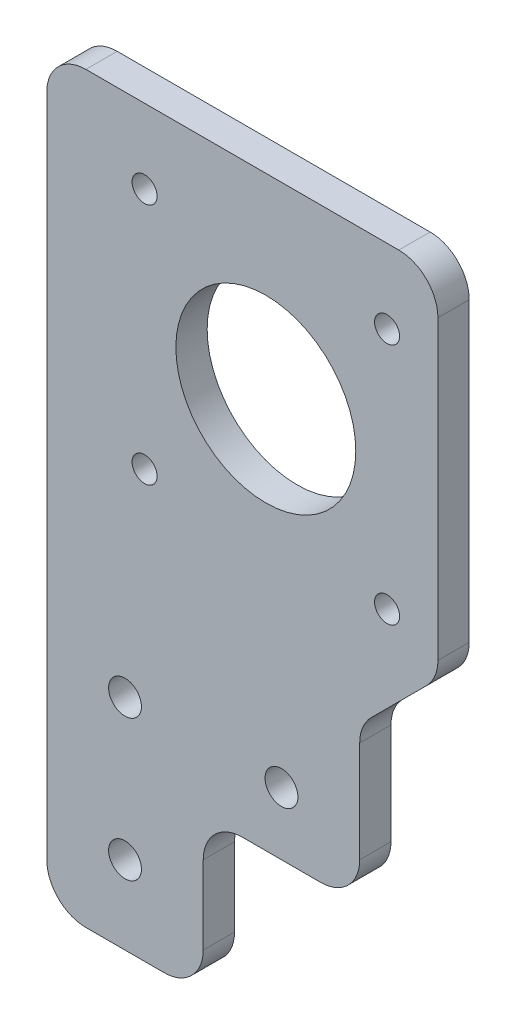
ISO-10303-21;
HEADER;
FILE_DESCRIPTION(('STEP AP214'),'2;1');
FILE_NAME('part.step','',(''),(''),'','','');
FILE_SCHEMA(('AUTOMOTIVE_DESIGN { 1 0 10303 214 1 1 1 1 }'));
ENDSEC;
DATA;
#1=APPLICATION_CONTEXT('core data for automotive mechanical design processes');
#2=APPLICATION_PROTOCOL_DEFINITION('international standard','automotive_design',2000,#1);
#3=PRODUCT_CONTEXT('',#1,'mechanical');
#4=PRODUCT('Part','Part','',(#3));
#5=PRODUCT_RELATED_PRODUCT_CATEGORY('part','',(#4));
#6=PRODUCT_DEFINITION_FORMATION('','',#4);
#7=PRODUCT_DEFINITION_CONTEXT('part definition',#1,'design');
#8=PRODUCT_DEFINITION('design','',#6,#7);
#9=PRODUCT_DEFINITION_SHAPE('','',#8);
#10=(LENGTH_UNIT() NAMED_UNIT(*) SI_UNIT(.MILLI.,.METRE.));
#11=(NAMED_UNIT(*) PLANE_ANGLE_UNIT() SI_UNIT($,.RADIAN.));
#12=(NAMED_UNIT(*) SI_UNIT($,.STERADIAN.) SOLID_ANGLE_UNIT());
#13=UNCERTAINTY_MEASURE_WITH_UNIT(LENGTH_MEASURE(1.E-05),#10,'distance_accuracy_value','');
#14=(GEOMETRIC_REPRESENTATION_CONTEXT(3) GLOBAL_UNCERTAINTY_ASSIGNED_CONTEXT((#13)) GLOBAL_UNIT_ASSIGNED_CONTEXT((#10,
#11,#12)) REPRESENTATION_CONTEXT('',''));
#15=CARTESIAN_POINT('',(0.,0.,0.));
#16=DIRECTION('',(0.,0.,1.));
#17=DIRECTION('',(1.,0.,0.));
#18=AXIS2_PLACEMENT_3D('',#15,#16,#17);
#19=CARTESIAN_POINT('',(269.028205207631,151.235355522005,4.));
#20=DIRECTION('',(0.,0.,1.));
#21=DIRECTION('',(1.,0.,0.));
#22=AXIS2_PLACEMENT_3D('',#19,#20,#21);
#23=PLANE('',#22);
#24=CARTESIAN_POINT('',(234.028275207634,109.16437185227,4.));
#25=DIRECTION('',(0.,0.,1.));
#26=DIRECTION('',(1.,0.,0.));
#27=AXIS2_PLACEMENT_3D('',#24,#25,#26);
#28=CIRCLE('',#27,2.09999579999995);
#29=CARTESIAN_POINT('',(236.128271007633,109.16437185227,4.));
#30=VERTEX_POINT('',#29);
#31=EDGE_CURVE('E358',#30,#30,#28,.T.);
#32=ORIENTED_EDGE('',*,*,#31,.F.);
#33=EDGE_LOOP('',(#32));
#34=FACE_BOUND('',#33,.T.);
#35=CARTESIAN_POINT('',(254.028235207634,127.164335852281,4.));
#36=DIRECTION('',(0.,0.,1.));
#37=DIRECTION('',(1.,0.,0.));
#38=AXIS2_PLACEMENT_3D('',#35,#36,#37);
#39=CIRCLE('',#38,2.09999579999998);
#40=CARTESIAN_POINT('',(256.128231007633,127.164335852281,4.));
#41=VERTEX_POINT('',#40);
#42=EDGE_CURVE('E370',#41,#41,#39,.T.);
#43=ORIENTED_EDGE('',*,*,#42,.F.);
#44=EDGE_LOOP('',(#43));
#45=FACE_BOUND('',#44,.T.);
#46=CARTESIAN_POINT('',(236.528270207633,153.664282852282,4.));
#47=DIRECTION('',(0.,0.,1.));
#48=DIRECTION('',(1.,0.,0.));
#49=AXIS2_PLACEMENT_3D('',#46,#47,#48);
#50=CIRCLE('',#49,1.59999679999998);
#51=CARTESIAN_POINT('',(238.128267007633,153.664282852282,4.));
#52=VERTEX_POINT('',#51);
#53=EDGE_CURVE('E382',#52,#52,#50,.T.);
#54=ORIENTED_EDGE('',*,*,#53,.F.);
#55=EDGE_LOOP('',(#54));
#56=FACE_BOUND('',#55,.T.);
#57=CARTESIAN_POINT('',(267.528208207634,184.664220852282,4.));
#58=DIRECTION('',(0.,0.,1.));
#59=DIRECTION('',(1.,0.,0.));
#60=AXIS2_PLACEMENT_3D('',#57,#58,#59);
#61=CIRCLE('',#60,1.59999679999995);
#62=CARTESIAN_POINT('',(269.128205007634,184.664220852282,4.));
#63=VERTEX_POINT('',#62);
#64=EDGE_CURVE('E181',#63,#63,#61,.T.);
#65=ORIENTED_EDGE('',*,*,#64,.F.);
#66=EDGE_LOOP('',(#65));
#67=FACE_BOUND('',#66,.T.);
#68=CARTESIAN_POINT('',(269.028205207631,151.235355522005,4.));
#69=DIRECTION('',(0.,0.,1.));
#70=DIRECTION('',(1.,0.,0.));
#71=AXIS2_PLACEMENT_3D('',#68,#69,#70);
#72=CIRCLE('',#71,4.99998999999902);
#73=CARTESIAN_POINT('',(272.563732042496,147.699828687141,4.));
#74=VERTEX_POINT('',#73);
#75=CARTESIAN_POINT('',(274.02819520763,151.235355522005,4.));
#76=VERTEX_POINT('',#75);
#77=EDGE_CURVE('E208',#74,#76,#72,.T.);
#78=ORIENTED_EDGE('',*,*,#77,.T.);
#79=DIRECTION('',(0.,1.,0.));
#80=VECTOR('',#79,1.);
#81=CARTESIAN_POINT('',(274.02819520763,189.16421185227,4.));
#82=LINE('',#81,#80);
#83=CARTESIAN_POINT('',(274.02819520763,189.16421185227,4.));
#84=VERTEX_POINT('',#83);
#85=EDGE_CURVE('E116',#76,#84,#82,.T.);
#86=ORIENTED_EDGE('',*,*,#85,.T.);
#87=CARTESIAN_POINT('',(269.02820520763,189.164211852282,4.));
#88=DIRECTION('',(0.,0.,1.));
#89=DIRECTION('',(1.,0.,0.));
#90=AXIS2_PLACEMENT_3D('',#87,#88,#89);
#91=CIRCLE('',#90,4.9999899999999);
#92=CARTESIAN_POINT('',(269.028205207634,194.164201852282,4.));
#93=VERTEX_POINT('',#92);
#94=EDGE_CURVE('E247',#84,#93,#91,.T.);
#95=ORIENTED_EDGE('',*,*,#94,.T.);
#96=DIRECTION('',(-1.,0.,0.));
#97=VECTOR('',#96,1.);
#98=CARTESIAN_POINT('',(229.028285207634,194.164201852282,4.));
#99=LINE('',#98,#97);
#100=CARTESIAN_POINT('',(229.028285207634,194.164201852282,4.));
#101=VERTEX_POINT('',#100);
#102=EDGE_CURVE('E266',#93,#101,#99,.T.);
#103=ORIENTED_EDGE('',*,*,#102,.T.);
#104=CARTESIAN_POINT('',(229.028285207633,189.164211852282,4.));
#105=DIRECTION('',(0.,0.,1.));
#106=DIRECTION('',(1.,0.,0.));
#107=AXIS2_PLACEMENT_3D('',#104,#105,#106);
#108=CIRCLE('',#107,4.99999000000008);
#109=CARTESIAN_POINT('',(224.028295207633,189.164211852282,4.));
#110=VERTEX_POINT('',#109);
#111=EDGE_CURVE('E263',#101,#110,#108,.T.);
#112=ORIENTED_EDGE('',*,*,#111,.T.);
#113=DIRECTION('',(0.,-1.,0.));
#114=VECTOR('',#113,1.);
#115=CARTESIAN_POINT('',(224.028295207634,104.164381852281,4.));
#116=LINE('',#115,#114);
#117=CARTESIAN_POINT('',(224.028295207634,104.164381852281,4.));
#118=VERTEX_POINT('',#117);
#119=EDGE_CURVE('E265',#110,#118,#116,.T.);
#120=ORIENTED_EDGE('',*,*,#119,.T.);
#121=CARTESIAN_POINT('',(229.028285207633,104.164381852281,4.));
#122=DIRECTION('',(0.,0.,1.));
#123=DIRECTION('',(1.,0.,0.));
#124=AXIS2_PLACEMENT_3D('',#121,#122,#123);
#125=CIRCLE('',#124,4.99998999999979);
#126=CARTESIAN_POINT('',(229.028285207633,99.1643918522813,4.));
#127=VERTEX_POINT('',#126);
#128=EDGE_CURVE('E268',#118,#127,#125,.T.);
#129=ORIENTED_EDGE('',*,*,#128,.T.);
#130=DIRECTION('',(1.,0.,0.));
#131=VECTOR('',#130,1.);
#132=CARTESIAN_POINT('',(239.028265207634,99.1643918522822,4.));
#133=LINE('',#132,#131);
#134=CARTESIAN_POINT('',(239.028265207634,99.1643918522822,4.));
#135=VERTEX_POINT('',#134);
#136=EDGE_CURVE('E274',#127,#135,#133,.T.);
#137=ORIENTED_EDGE('',*,*,#136,.T.);
#138=CARTESIAN_POINT('',(239.028265207634,104.164381852281,4.));
#139=DIRECTION('',(0.,0.,1.));
#140=DIRECTION('',(1.,0.,0.));
#141=AXIS2_PLACEMENT_3D('',#138,#139,#140);
#142=CIRCLE('',#141,4.99998999999905);
#143=CARTESIAN_POINT('',(244.028255207633,104.164381852278,4.));
#144=VERTEX_POINT('',#143);
#145=EDGE_CURVE('E276',#135,#144,#142,.T.);
#146=ORIENTED_EDGE('',*,*,#145,.T.);
#147=DIRECTION('',(0.,1.,0.));
#148=VECTOR('',#147,1.);
#149=CARTESIAN_POINT('',(244.028255207633,114.164361852279,4.));
#150=LINE('',#149,#148);
#151=CARTESIAN_POINT('',(244.028255207633,114.164361852279,4.));
#152=VERTEX_POINT('',#151);
#153=EDGE_CURVE('E278',#144,#152,#150,.T.);
#154=ORIENTED_EDGE('',*,*,#153,.T.);
#155=CARTESIAN_POINT('',(249.028245207632,114.164361852279,4.));
#156=DIRECTION('',(0.,0.,-1.));
#157=DIRECTION('',(1.,0.,0.));
#158=AXIS2_PLACEMENT_3D('',#155,#156,#157);
#159=CIRCLE('',#158,4.99998999999984);
#160=CARTESIAN_POINT('',(249.02824520763,119.164351852279,4.));
#161=VERTEX_POINT('',#160);
#162=EDGE_CURVE('E280',#152,#161,#159,.T.);
#163=ORIENTED_EDGE('',*,*,#162,.T.);
#164=DIRECTION('',(1.,0.,0.));
#165=VECTOR('',#164,1.);
#166=CARTESIAN_POINT('',(259.02822520763,119.164351852279,4.));
#167=LINE('',#166,#165);
#168=CARTESIAN_POINT('',(259.02822520763,119.164351852279,4.));
#169=VERTEX_POINT('',#168);
#170=EDGE_CURVE('E282',#161,#169,#167,.T.);
#171=ORIENTED_EDGE('',*,*,#170,.T.);
#172=CARTESIAN_POINT('',(259.02822520763,124.164341852279,4.));
#173=DIRECTION('',(0.,0.,1.));
#174=DIRECTION('',(1.,0.,0.));
#175=AXIS2_PLACEMENT_3D('',#172,#173,#174);
#176=CIRCLE('',#175,4.9999899999999);
#177=CARTESIAN_POINT('',(264.02821520763,124.164341852278,4.));
#178=VERTEX_POINT('',#177);
#179=EDGE_CURVE('E159',#169,#178,#176,.T.);
#180=ORIENTED_EDGE('',*,*,#179,.T.);
#181=DIRECTION('',(0.,1.,0.));
#182=VECTOR('',#181,1.);
#183=CARTESIAN_POINT('',(264.02821520763,137.093248182546,4.));
#184=LINE('',#183,#182);
#185=CARTESIAN_POINT('',(264.02821520763,137.093248182546,4.));
#186=VERTEX_POINT('',#185);
#187=EDGE_CURVE('E153',#178,#186,#184,.T.);
#188=ORIENTED_EDGE('',*,*,#187,.T.);
#189=CARTESIAN_POINT('',(269.02820520763,137.093248182546,4.));
#190=DIRECTION('',(0.,0.,-1.));
#191=DIRECTION('',(1.,0.,0.));
#192=AXIS2_PLACEMENT_3D('',#189,#190,#191);
#193=CIRCLE('',#192,4.99998999999946);
#194=CARTESIAN_POINT('',(265.492678372765,140.628775017411,4.));
#195=VERTEX_POINT('',#194);
#196=EDGE_CURVE('E157',#186,#195,#193,.T.);
#197=ORIENTED_EDGE('',*,*,#196,.T.);
#198=DIRECTION('',(0.707106781186546,0.707106781186549,0.));
#199=VECTOR('',#198,1.);
#200=CARTESIAN_POINT('',(272.563732042496,147.699828687141,4.));
#201=LINE('',#200,#199);
#202=EDGE_CURVE('E49',#195,#74,#201,.T.);
#203=ORIENTED_EDGE('',*,*,#202,.T.);
#204=EDGE_LOOP('',(#78,#86,#95,#103,#112,#120,#129,#137,#146,#154,#163,#171,#180,#188,#197,#203));
#205=FACE_BOUND('',#204,.T.);
#206=CARTESIAN_POINT('',(267.528208207634,153.664282852282,4.));
#207=DIRECTION('',(0.,0.,1.));
#208=DIRECTION('',(1.,0.,0.));
#209=AXIS2_PLACEMENT_3D('',#206,#207,#208);
#210=CIRCLE('',#209,1.5999968);
#211=CARTESIAN_POINT('',(269.128205007634,153.664282852282,4.));
#212=VERTEX_POINT('',#211);
#213=EDGE_CURVE('E388',#212,#212,#210,.T.);
#214=ORIENTED_EDGE('',*,*,#213,.F.);
#215=EDGE_LOOP('',(#214));
#216=FACE_BOUND('',#215,.T.);
#217=CARTESIAN_POINT('',(236.528270207633,184.664220852282,4.));
#218=DIRECTION('',(0.,0.,1.));
#219=DIRECTION('',(1.,0.,0.));
#220=AXIS2_PLACEMENT_3D('',#217,#218,#219);
#221=CIRCLE('',#220,1.59999679999998);
#222=CARTESIAN_POINT('',(238.128267007633,184.664220852282,4.));
#223=VERTEX_POINT('',#222);
#224=EDGE_CURVE('E376',#223,#223,#221,.T.);
#225=ORIENTED_EDGE('',*,*,#224,.F.);
#226=EDGE_LOOP('',(#225));
#227=FACE_BOUND('',#226,.T.);
#228=CARTESIAN_POINT('',(234.028275207634,127.164335852281,4.));
#229=DIRECTION('',(0.,0.,1.));
#230=DIRECTION('',(1.,0.,0.));
#231=AXIS2_PLACEMENT_3D('',#228,#229,#230);
#232=CIRCLE('',#231,2.09999580000003);
#233=CARTESIAN_POINT('',(236.128271007634,127.164335852281,4.));
#234=VERTEX_POINT('',#233);
#235=EDGE_CURVE('E364',#234,#234,#232,.T.);
#236=ORIENTED_EDGE('',*,*,#235,.F.);
#237=EDGE_LOOP('',(#236));
#238=FACE_BOUND('',#237,.T.);
#239=CARTESIAN_POINT('',(252.028239207634,169.164251852282,4.));
#240=DIRECTION('',(0.,0.,1.));
#241=DIRECTION('',(1.,0.,0.));
#242=AXIS2_PLACEMENT_3D('',#239,#240,#241);
#243=CIRCLE('',#242,11.499977);
#244=CARTESIAN_POINT('',(263.528216207633,169.164251852282,4.));
#245=VERTEX_POINT('',#244);
#246=EDGE_CURVE('E349',#245,#245,#243,.T.);
#247=ORIENTED_EDGE('',*,*,#246,.F.);
#248=EDGE_LOOP('',(#247));
#249=FACE_BOUND('',#248,.T.);
#250=ADVANCED_FACE('F32',(#34,#45,#56,#67,#205,#216,#227,#238,#249),#23,.T.);
#251=CARTESIAN_POINT('',(269.028205207631,151.235355522005,0.));
#252=DIRECTION('',(0.,0.,1.));
#253=DIRECTION('',(1.,0.,0.));
#254=AXIS2_PLACEMENT_3D('',#251,#252,#253);
#255=PLANE('',#254);
#256=CARTESIAN_POINT('',(269.028205207631,151.235355522005,0.));
#257=DIRECTION('',(0.,0.,1.));
#258=DIRECTION('',(1.,0.,0.));
#259=AXIS2_PLACEMENT_3D('',#256,#257,#258);
#260=CIRCLE('',#259,4.99998999999902);
#261=CARTESIAN_POINT('',(272.563732042496,147.699828687141,0.));
#262=VERTEX_POINT('',#261);
#263=CARTESIAN_POINT('',(274.02819520763,151.235355522005,0.));
#264=VERTEX_POINT('',#263);
#265=EDGE_CURVE('E177',#262,#264,#260,.T.);
#266=ORIENTED_EDGE('',*,*,#265,.F.);
#267=DIRECTION('',(0.707106781186546,0.707106781186549,0.));
#268=VECTOR('',#267,1.);
#269=CARTESIAN_POINT('',(272.563732042496,147.699828687141,0.));
#270=LINE('',#269,#268);
#271=CARTESIAN_POINT('',(265.492678372765,140.628775017411,0.));
#272=VERTEX_POINT('',#271);
#273=EDGE_CURVE('E108',#272,#262,#270,.T.);
#274=ORIENTED_EDGE('',*,*,#273,.F.);
#275=CARTESIAN_POINT('',(269.02820520763,137.093248182546,0.));
#276=DIRECTION('',(0.,0.,-1.));
#277=DIRECTION('',(1.,0.,0.));
#278=AXIS2_PLACEMENT_3D('',#275,#276,#277);
#279=CIRCLE('',#278,4.99998999999946);
#280=CARTESIAN_POINT('',(264.02821520763,137.093248182546,0.));
#281=VERTEX_POINT('',#280);
#282=EDGE_CURVE('E102',#281,#272,#279,.T.);
#283=ORIENTED_EDGE('',*,*,#282,.F.);
#284=DIRECTION('',(0.,1.,0.));
#285=VECTOR('',#284,1.);
#286=CARTESIAN_POINT('',(264.02821520763,137.093248182546,0.));
#287=LINE('',#286,#285);
#288=CARTESIAN_POINT('',(264.02821520763,124.164341852278,0.));
#289=VERTEX_POINT('',#288);
#290=EDGE_CURVE('E167',#289,#281,#287,.T.);
#291=ORIENTED_EDGE('',*,*,#290,.F.);
#292=CARTESIAN_POINT('',(259.02822520763,124.164341852279,0.));
#293=DIRECTION('',(0.,0.,1.));
#294=DIRECTION('',(1.,0.,0.));
#295=AXIS2_PLACEMENT_3D('',#292,#293,#294);
#296=CIRCLE('',#295,4.9999899999999);
#297=CARTESIAN_POINT('',(259.02822520763,119.164351852279,0.));
#298=VERTEX_POINT('',#297);
#299=EDGE_CURVE('E203',#298,#289,#296,.T.);
#300=ORIENTED_EDGE('',*,*,#299,.F.);
#301=DIRECTION('',(1.,0.,0.));
#302=VECTOR('',#301,1.);
#303=CARTESIAN_POINT('',(259.02822520763,119.164351852279,0.));
#304=LINE('',#303,#302);
#305=CARTESIAN_POINT('',(249.02824520763,119.164351852279,0.));
#306=VERTEX_POINT('',#305);
#307=EDGE_CURVE('E201',#306,#298,#304,.T.);
#308=ORIENTED_EDGE('',*,*,#307,.F.);
#309=CARTESIAN_POINT('',(249.028245207632,114.164361852279,0.));
#310=DIRECTION('',(0.,0.,-1.));
#311=DIRECTION('',(1.,0.,0.));
#312=AXIS2_PLACEMENT_3D('',#309,#310,#311);
#313=CIRCLE('',#312,4.99998999999984);
#314=CARTESIAN_POINT('',(244.028255207633,114.164361852279,0.));
#315=VERTEX_POINT('',#314);
#316=EDGE_CURVE('E199',#315,#306,#313,.T.);
#317=ORIENTED_EDGE('',*,*,#316,.F.);
#318=DIRECTION('',(0.,1.,0.));
#319=VECTOR('',#318,1.);
#320=CARTESIAN_POINT('',(244.028255207633,114.164361852279,0.));
#321=LINE('',#320,#319);
#322=CARTESIAN_POINT('',(244.028255207633,104.164381852278,0.));
#323=VERTEX_POINT('',#322);
#324=EDGE_CURVE('E197',#323,#315,#321,.T.);
#325=ORIENTED_EDGE('',*,*,#324,.F.);
#326=CARTESIAN_POINT('',(239.028265207634,104.164381852281,0.));
#327=DIRECTION('',(0.,0.,1.));
#328=DIRECTION('',(1.,0.,0.));
#329=AXIS2_PLACEMENT_3D('',#326,#327,#328);
#330=CIRCLE('',#329,4.99998999999905);
#331=CARTESIAN_POINT('',(239.028265207634,99.1643918522822,0.));
#332=VERTEX_POINT('',#331);
#333=EDGE_CURVE('E195',#332,#323,#330,.T.);
#334=ORIENTED_EDGE('',*,*,#333,.F.);
#335=DIRECTION('',(1.,0.,0.));
#336=VECTOR('',#335,1.);
#337=CARTESIAN_POINT('',(239.028265207634,99.1643918522822,0.));
#338=LINE('',#337,#336);
#339=CARTESIAN_POINT('',(229.028285207633,99.1643918522813,0.));
#340=VERTEX_POINT('',#339);
#341=EDGE_CURVE('E193',#340,#332,#338,.T.);
#342=ORIENTED_EDGE('',*,*,#341,.F.);
#343=CARTESIAN_POINT('',(229.028285207633,104.164381852281,0.));
#344=DIRECTION('',(0.,0.,1.));
#345=DIRECTION('',(1.,0.,0.));
#346=AXIS2_PLACEMENT_3D('',#343,#344,#345);
#347=CIRCLE('',#346,4.99998999999979);
#348=CARTESIAN_POINT('',(224.028295207634,104.164381852281,0.));
#349=VERTEX_POINT('',#348);
#350=EDGE_CURVE('E191',#349,#340,#347,.T.);
#351=ORIENTED_EDGE('',*,*,#350,.F.);
#352=DIRECTION('',(0.,-1.,0.));
#353=VECTOR('',#352,1.);
#354=CARTESIAN_POINT('',(224.028295207634,104.164381852281,0.));
#355=LINE('',#354,#353);
#356=CARTESIAN_POINT('',(224.028295207633,189.164211852282,0.));
#357=VERTEX_POINT('',#356);
#358=EDGE_CURVE('E189',#357,#349,#355,.T.);
#359=ORIENTED_EDGE('',*,*,#358,.F.);
#360=CARTESIAN_POINT('',(229.028285207633,189.164211852282,0.));
#361=DIRECTION('',(0.,0.,1.));
#362=DIRECTION('',(1.,0.,0.));
#363=AXIS2_PLACEMENT_3D('',#360,#361,#362);
#364=CIRCLE('',#363,4.99999000000008);
#365=CARTESIAN_POINT('',(229.028285207634,194.164201852282,0.));
#366=VERTEX_POINT('',#365);
#367=EDGE_CURVE('E187',#366,#357,#364,.T.);
#368=ORIENTED_EDGE('',*,*,#367,.F.);
#369=DIRECTION('',(-1.,0.,0.));
#370=VECTOR('',#369,1.);
#371=CARTESIAN_POINT('',(229.028285207634,194.164201852282,0.));
#372=LINE('',#371,#370);
#373=CARTESIAN_POINT('',(269.028205207634,194.164201852282,0.));
#374=VERTEX_POINT('',#373);
#375=EDGE_CURVE('E185',#374,#366,#372,.T.);
#376=ORIENTED_EDGE('',*,*,#375,.F.);
#377=CARTESIAN_POINT('',(269.02820520763,189.164211852282,0.));
#378=DIRECTION('',(0.,0.,1.));
#379=DIRECTION('',(1.,0.,0.));
#380=AXIS2_PLACEMENT_3D('',#377,#378,#379);
#381=CIRCLE('',#380,4.9999899999999);
#382=CARTESIAN_POINT('',(274.02819520763,189.16421185227,0.));
#383=VERTEX_POINT('',#382);
#384=EDGE_CURVE('E183',#383,#374,#381,.T.);
#385=ORIENTED_EDGE('',*,*,#384,.F.);
#386=DIRECTION('',(0.,1.,0.));
#387=VECTOR('',#386,1.);
#388=CARTESIAN_POINT('',(274.02819520763,189.16421185227,0.));
#389=LINE('',#388,#387);
#390=EDGE_CURVE('E180',#264,#383,#389,.T.);
#391=ORIENTED_EDGE('',*,*,#390,.F.);
#392=EDGE_LOOP('',(#266,#274,#283,#291,#300,#308,#317,#325,#334,#342,#351,#359,#368,#376,#385,#391));
#393=FACE_BOUND('',#392,.T.);
#394=CARTESIAN_POINT('',(267.528208207634,184.664220852282,0.));
#395=DIRECTION('',(0.,0.,1.));
#396=DIRECTION('',(1.,0.,0.));
#397=AXIS2_PLACEMENT_3D('',#394,#395,#396);
#398=CIRCLE('',#397,1.59999679999995);
#399=CARTESIAN_POINT('',(269.128205007634,184.664220852282,0.));
#400=VERTEX_POINT('',#399);
#401=EDGE_CURVE('E391',#400,#400,#398,.T.);
#402=ORIENTED_EDGE('',*,*,#401,.T.);
#403=EDGE_LOOP('',(#402));
#404=FACE_BOUND('',#403,.T.);
#405=CARTESIAN_POINT('',(267.528208207634,153.664282852282,0.));
#406=DIRECTION('',(0.,0.,1.));
#407=DIRECTION('',(1.,0.,0.));
#408=AXIS2_PLACEMENT_3D('',#405,#406,#407);
#409=CIRCLE('',#408,1.5999968);
#410=CARTESIAN_POINT('',(269.128205007634,153.664282852282,0.));
#411=VERTEX_POINT('',#410);
#412=EDGE_CURVE('E385',#411,#411,#409,.T.);
#413=ORIENTED_EDGE('',*,*,#412,.T.);
#414=EDGE_LOOP('',(#413));
#415=FACE_BOUND('',#414,.T.);
#416=CARTESIAN_POINT('',(236.528270207633,153.664282852282,0.));
#417=DIRECTION('',(0.,0.,1.));
#418=DIRECTION('',(1.,0.,0.));
#419=AXIS2_PLACEMENT_3D('',#416,#417,#418);
#420=CIRCLE('',#419,1.59999679999998);
#421=CARTESIAN_POINT('',(238.128267007633,153.664282852282,0.));
#422=VERTEX_POINT('',#421);
#423=EDGE_CURVE('E379',#422,#422,#420,.T.);
#424=ORIENTED_EDGE('',*,*,#423,.T.);
#425=EDGE_LOOP('',(#424));
#426=FACE_BOUND('',#425,.T.);
#427=CARTESIAN_POINT('',(236.528270207633,184.664220852282,0.));
#428=DIRECTION('',(0.,0.,1.));
#429=DIRECTION('',(1.,0.,0.));
#430=AXIS2_PLACEMENT_3D('',#427,#428,#429);
#431=CIRCLE('',#430,1.59999679999998);
#432=CARTESIAN_POINT('',(238.128267007633,184.664220852282,0.));
#433=VERTEX_POINT('',#432);
#434=EDGE_CURVE('E373',#433,#433,#431,.T.);
#435=ORIENTED_EDGE('',*,*,#434,.T.);
#436=EDGE_LOOP('',(#435));
#437=FACE_BOUND('',#436,.T.);
#438=CARTESIAN_POINT('',(254.028235207634,127.164335852281,0.));
#439=DIRECTION('',(0.,0.,1.));
#440=DIRECTION('',(1.,0.,0.));
#441=AXIS2_PLACEMENT_3D('',#438,#439,#440);
#442=CIRCLE('',#441,2.09999579999998);
#443=CARTESIAN_POINT('',(256.128231007633,127.164335852281,0.));
#444=VERTEX_POINT('',#443);
#445=EDGE_CURVE('E367',#444,#444,#442,.T.);
#446=ORIENTED_EDGE('',*,*,#445,.T.);
#447=EDGE_LOOP('',(#446));
#448=FACE_BOUND('',#447,.T.);
#449=CARTESIAN_POINT('',(234.028275207634,127.164335852281,0.));
#450=DIRECTION('',(0.,0.,1.));
#451=DIRECTION('',(1.,0.,0.));
#452=AXIS2_PLACEMENT_3D('',#449,#450,#451);
#453=CIRCLE('',#452,2.09999580000003);
#454=CARTESIAN_POINT('',(236.128271007634,127.164335852281,0.));
#455=VERTEX_POINT('',#454);
#456=EDGE_CURVE('E361',#455,#455,#453,.T.);
#457=ORIENTED_EDGE('',*,*,#456,.T.);
#458=EDGE_LOOP('',(#457));
#459=FACE_BOUND('',#458,.T.);
#460=CARTESIAN_POINT('',(234.028275207634,109.16437185227,0.));
#461=DIRECTION('',(0.,0.,1.));
#462=DIRECTION('',(1.,0.,0.));
#463=AXIS2_PLACEMENT_3D('',#460,#461,#462);
#464=CIRCLE('',#463,2.09999579999995);
#465=CARTESIAN_POINT('',(236.128271007633,109.16437185227,0.));
#466=VERTEX_POINT('',#465);
#467=EDGE_CURVE('E355',#466,#466,#464,.T.);
#468=ORIENTED_EDGE('',*,*,#467,.T.);
#469=EDGE_LOOP('',(#468));
#470=FACE_BOUND('',#469,.T.);
#471=CARTESIAN_POINT('',(252.028239207634,169.164251852282,0.));
#472=DIRECTION('',(0.,0.,1.));
#473=DIRECTION('',(1.,0.,0.));
#474=AXIS2_PLACEMENT_3D('',#471,#472,#473);
#475=CIRCLE('',#474,11.499977);
#476=CARTESIAN_POINT('',(263.528216207633,169.164251852282,0.));
#477=VERTEX_POINT('',#476);
#478=EDGE_CURVE('E352',#477,#477,#475,.T.);
#479=ORIENTED_EDGE('',*,*,#478,.T.);
#480=EDGE_LOOP('',(#479));
#481=FACE_BOUND('',#480,.T.);
#482=ADVANCED_FACE('F251',(#393,#404,#415,#426,#437,#448,#459,#470,#481),#255,.F.);
#483=CARTESIAN_POINT('',(269.028205207631,151.235355522005,4.));
#484=DIRECTION('',(0.,0.,-1.));
#485=DIRECTION('',(-1.,0.,0.));
#486=AXIS2_PLACEMENT_3D('',#483,#484,#485);
#487=CYLINDRICAL_SURFACE('',#486,4.99998999999902);
#488=ORIENTED_EDGE('',*,*,#265,.T.);
#489=DIRECTION('',(0.,0.,-1.));
#490=VECTOR('',#489,1.);
#491=CARTESIAN_POINT('',(274.02819520763,151.235355522005,4.));
#492=LINE('',#491,#490);
#493=EDGE_CURVE('E11',#76,#264,#492,.T.);
#494=ORIENTED_EDGE('',*,*,#493,.F.);
#495=ORIENTED_EDGE('',*,*,#77,.F.);
#496=DIRECTION('',(0.,0.,-1.));
#497=VECTOR('',#496,1.);
#498=CARTESIAN_POINT('',(272.563732042496,147.699828687141,4.));
#499=LINE('',#498,#497);
#500=EDGE_CURVE('E173',#74,#262,#499,.T.);
#501=ORIENTED_EDGE('',*,*,#500,.T.);
#502=EDGE_LOOP('',(#488,#494,#495,#501));
#503=FACE_BOUND('',#502,.T.);
#504=ADVANCED_FACE('F34',(#503),#487,.T.);
#505=CARTESIAN_POINT('',(274.02819520763,189.16421185227,4.));
#506=DIRECTION('',(-1.,0.,0.));
#507=DIRECTION('',(0.,0.,1.));
#508=AXIS2_PLACEMENT_3D('',#505,#506,#507);
#509=PLANE('',#508);
#510=ORIENTED_EDGE('',*,*,#390,.T.);
#511=DIRECTION('',(0.,0.,-1.));
#512=VECTOR('',#511,1.);
#513=CARTESIAN_POINT('',(274.02819520763,189.16421185227,4.));
#514=LINE('',#513,#512);
#515=EDGE_CURVE('E41',#84,#383,#514,.T.);
#516=ORIENTED_EDGE('',*,*,#515,.F.);
#517=ORIENTED_EDGE('',*,*,#85,.F.);
#518=ORIENTED_EDGE('',*,*,#493,.T.);
#519=EDGE_LOOP('',(#510,#516,#517,#518));
#520=FACE_BOUND('',#519,.T.);
#521=ADVANCED_FACE('F577',(#520),#509,.F.);
#522=CARTESIAN_POINT('',(269.02820520763,189.164211852282,4.));
#523=DIRECTION('',(0.,0.,-1.));
#524=DIRECTION('',(-1.,0.,0.));
#525=AXIS2_PLACEMENT_3D('',#522,#523,#524);
#526=CYLINDRICAL_SURFACE('',#525,4.9999899999999);
#527=ORIENTED_EDGE('',*,*,#384,.T.);
#528=DIRECTION('',(0.,0.,-1.));
#529=VECTOR('',#528,1.);
#530=CARTESIAN_POINT('',(269.028205207634,194.164201852282,4.));
#531=LINE('',#530,#529);
#532=EDGE_CURVE('E239',#93,#374,#531,.T.);
#533=ORIENTED_EDGE('',*,*,#532,.F.);
#534=ORIENTED_EDGE('',*,*,#94,.F.);
#535=ORIENTED_EDGE('',*,*,#515,.T.);
#536=EDGE_LOOP('',(#527,#533,#534,#535));
#537=FACE_BOUND('',#536,.T.);
#538=ADVANCED_FACE('F245',(#537),#526,.T.);
#539=CARTESIAN_POINT('',(229.028285207634,194.164201852282,4.));
#540=DIRECTION('',(0.,-1.,0.));
#541=DIRECTION('',(1.,0.,0.));
#542=AXIS2_PLACEMENT_3D('',#539,#540,#541);
#543=PLANE('',#542);
#544=ORIENTED_EDGE('',*,*,#375,.T.);
#545=DIRECTION('',(0.,0.,-1.));
#546=VECTOR('',#545,1.);
#547=CARTESIAN_POINT('',(229.028285207634,194.164201852282,4.));
#548=LINE('',#547,#546);
#549=EDGE_CURVE('E236',#101,#366,#548,.T.);
#550=ORIENTED_EDGE('',*,*,#549,.F.);
#551=ORIENTED_EDGE('',*,*,#102,.F.);
#552=ORIENTED_EDGE('',*,*,#532,.T.);
#553=EDGE_LOOP('',(#544,#550,#551,#552));
#554=FACE_BOUND('',#553,.T.);
#555=ADVANCED_FACE('F257',(#554),#543,.F.);
#556=CARTESIAN_POINT('',(229.028285207633,189.164211852282,4.));
#557=DIRECTION('',(0.,0.,-1.));
#558=DIRECTION('',(-1.,0.,0.));
#559=AXIS2_PLACEMENT_3D('',#556,#557,#558);
#560=CYLINDRICAL_SURFACE('',#559,4.99999000000008);
#561=ORIENTED_EDGE('',*,*,#367,.T.);
#562=DIRECTION('',(0.,0.,-1.));
#563=VECTOR('',#562,1.);
#564=CARTESIAN_POINT('',(224.028295207633,189.164211852282,4.));
#565=LINE('',#564,#563);
#566=EDGE_CURVE('E233',#110,#357,#565,.T.);
#567=ORIENTED_EDGE('',*,*,#566,.F.);
#568=ORIENTED_EDGE('',*,*,#111,.F.);
#569=ORIENTED_EDGE('',*,*,#549,.T.);
#570=EDGE_LOOP('',(#561,#567,#568,#569));
#571=FACE_BOUND('',#570,.T.);
#572=ADVANCED_FACE('F261',(#571),#560,.T.);
#573=CARTESIAN_POINT('',(224.028295207634,104.164381852281,4.));
#574=DIRECTION('',(1.,0.,0.));
#575=DIRECTION('',(0.,1.,0.));
#576=AXIS2_PLACEMENT_3D('',#573,#574,#575);
#577=PLANE('',#576);
#578=ORIENTED_EDGE('',*,*,#358,.T.);
#579=DIRECTION('',(0.,0.,-1.));
#580=VECTOR('',#579,1.);
#581=CARTESIAN_POINT('',(224.028295207634,104.164381852281,4.));
#582=LINE('',#581,#580);
#583=EDGE_CURVE('E230',#118,#349,#582,.T.);
#584=ORIENTED_EDGE('',*,*,#583,.F.);
#585=ORIENTED_EDGE('',*,*,#119,.F.);
#586=ORIENTED_EDGE('',*,*,#566,.T.);
#587=EDGE_LOOP('',(#578,#584,#585,#586));
#588=FACE_BOUND('',#587,.T.);
#589=ADVANCED_FACE('F542',(#588),#577,.F.);
#590=CARTESIAN_POINT('',(229.028285207633,104.164381852281,4.));
#591=DIRECTION('',(0.,0.,-1.));
#592=DIRECTION('',(-1.,0.,0.));
#593=AXIS2_PLACEMENT_3D('',#590,#591,#592);
#594=CYLINDRICAL_SURFACE('',#593,4.99998999999979);
#595=ORIENTED_EDGE('',*,*,#350,.T.);
#596=DIRECTION('',(0.,0.,-1.));
#597=VECTOR('',#596,1.);
#598=CARTESIAN_POINT('',(229.028285207633,99.1643918522813,4.));
#599=LINE('',#598,#597);
#600=EDGE_CURVE('E227',#127,#340,#599,.T.);
#601=ORIENTED_EDGE('',*,*,#600,.F.);
#602=ORIENTED_EDGE('',*,*,#128,.F.);
#603=ORIENTED_EDGE('',*,*,#583,.T.);
#604=EDGE_LOOP('',(#595,#601,#602,#603));
#605=FACE_BOUND('',#604,.T.);
#606=ADVANCED_FACE('F532',(#605),#594,.T.);
#607=CARTESIAN_POINT('',(239.028265207634,99.1643918522822,4.));
#608=DIRECTION('',(0.,1.,0.));
#609=DIRECTION('',(-1.,0.,0.));
#610=AXIS2_PLACEMENT_3D('',#607,#608,#609);
#611=PLANE('',#610);
#612=ORIENTED_EDGE('',*,*,#341,.T.);
#613=DIRECTION('',(0.,0.,-1.));
#614=VECTOR('',#613,1.);
#615=CARTESIAN_POINT('',(239.028265207634,99.1643918522822,4.));
#616=LINE('',#615,#614);
#617=EDGE_CURVE('E224',#135,#332,#616,.T.);
#618=ORIENTED_EDGE('',*,*,#617,.F.);
#619=ORIENTED_EDGE('',*,*,#136,.F.);
#620=ORIENTED_EDGE('',*,*,#600,.T.);
#621=EDGE_LOOP('',(#612,#618,#619,#620));
#622=FACE_BOUND('',#621,.T.);
#623=ADVANCED_FACE('F522',(#622),#611,.F.);
#624=CARTESIAN_POINT('',(239.028265207634,104.164381852281,4.));
#625=DIRECTION('',(0.,0.,-1.));
#626=DIRECTION('',(-1.,0.,0.));
#627=AXIS2_PLACEMENT_3D('',#624,#625,#626);
#628=CYLINDRICAL_SURFACE('',#627,4.99998999999905);
#629=ORIENTED_EDGE('',*,*,#333,.T.);
#630=DIRECTION('',(0.,0.,-1.));
#631=VECTOR('',#630,1.);
#632=CARTESIAN_POINT('',(244.028255207633,104.164381852278,4.));
#633=LINE('',#632,#631);
#634=EDGE_CURVE('E221',#144,#323,#633,.T.);
#635=ORIENTED_EDGE('',*,*,#634,.F.);
#636=ORIENTED_EDGE('',*,*,#145,.F.);
#637=ORIENTED_EDGE('',*,*,#617,.T.);
#638=EDGE_LOOP('',(#629,#635,#636,#637));
#639=FACE_BOUND('',#638,.T.);
#640=ADVANCED_FACE('F512',(#639),#628,.T.);
#641=CARTESIAN_POINT('',(244.028255207633,114.164361852279,4.));
#642=DIRECTION('',(-1.,0.,0.));
#643=DIRECTION('',(0.,0.,1.));
#644=AXIS2_PLACEMENT_3D('',#641,#642,#643);
#645=PLANE('',#644);
#646=ORIENTED_EDGE('',*,*,#324,.T.);
#647=DIRECTION('',(0.,0.,-1.));
#648=VECTOR('',#647,1.);
#649=CARTESIAN_POINT('',(244.028255207633,114.164361852279,4.));
#650=LINE('',#649,#648);
#651=EDGE_CURVE('E218',#152,#315,#650,.T.);
#652=ORIENTED_EDGE('',*,*,#651,.F.);
#653=ORIENTED_EDGE('',*,*,#153,.F.);
#654=ORIENTED_EDGE('',*,*,#634,.T.);
#655=EDGE_LOOP('',(#646,#652,#653,#654));
#656=FACE_BOUND('',#655,.T.);
#657=ADVANCED_FACE('F502',(#656),#645,.F.);
#658=CARTESIAN_POINT('',(249.028245207632,114.164361852279,4.));
#659=DIRECTION('',(0.,0.,-1.));
#660=DIRECTION('',(-1.,0.,0.));
#661=AXIS2_PLACEMENT_3D('',#658,#659,#660);
#662=CYLINDRICAL_SURFACE('',#661,4.99998999999984);
#663=ORIENTED_EDGE('',*,*,#316,.T.);
#664=DIRECTION('',(0.,0.,-1.));
#665=VECTOR('',#664,1.);
#666=CARTESIAN_POINT('',(249.02824520763,119.164351852279,4.));
#667=LINE('',#666,#665);
#668=EDGE_CURVE('E215',#161,#306,#667,.T.);
#669=ORIENTED_EDGE('',*,*,#668,.F.);
#670=ORIENTED_EDGE('',*,*,#162,.F.);
#671=ORIENTED_EDGE('',*,*,#651,.T.);
#672=EDGE_LOOP('',(#663,#669,#670,#671));
#673=FACE_BOUND('',#672,.T.);
#674=ADVANCED_FACE('F493',(#673),#662,.F.);
#675=CARTESIAN_POINT('',(259.02822520763,119.164351852279,4.));
#676=DIRECTION('',(0.,1.,0.));
#677=DIRECTION('',(0.,0.,1.));
#678=AXIS2_PLACEMENT_3D('',#675,#676,#677);
#679=PLANE('',#678);
#680=ORIENTED_EDGE('',*,*,#307,.T.);
#681=DIRECTION('',(0.,0.,-1.));
#682=VECTOR('',#681,1.);
#683=CARTESIAN_POINT('',(259.02822520763,119.164351852279,4.));
#684=LINE('',#683,#682);
#685=EDGE_CURVE('E212',#169,#298,#684,.T.);
#686=ORIENTED_EDGE('',*,*,#685,.F.);
#687=ORIENTED_EDGE('',*,*,#170,.F.);
#688=ORIENTED_EDGE('',*,*,#668,.T.);
#689=EDGE_LOOP('',(#680,#686,#687,#688));
#690=FACE_BOUND('',#689,.T.);
#691=ADVANCED_FACE('F288',(#690),#679,.F.);
#692=CARTESIAN_POINT('',(259.02822520763,124.164341852279,4.));
#693=DIRECTION('',(0.,0.,-1.));
#694=DIRECTION('',(-1.,0.,0.));
#695=AXIS2_PLACEMENT_3D('',#692,#693,#694);
#696=CYLINDRICAL_SURFACE('',#695,4.9999899999999);
#697=ORIENTED_EDGE('',*,*,#299,.T.);
#698=DIRECTION('',(0.,0.,-1.));
#699=VECTOR('',#698,1.);
#700=CARTESIAN_POINT('',(264.02821520763,124.164341852278,4.));
#701=LINE('',#700,#699);
#702=EDGE_CURVE('E168',#178,#289,#701,.T.);
#703=ORIENTED_EDGE('',*,*,#702,.F.);
#704=ORIENTED_EDGE('',*,*,#179,.F.);
#705=ORIENTED_EDGE('',*,*,#685,.T.);
#706=EDGE_LOOP('',(#697,#703,#704,#705));
#707=FACE_BOUND('',#706,.T.);
#708=ADVANCED_FACE('F292',(#707),#696,.T.);
#709=CARTESIAN_POINT('',(264.02821520763,137.093248182546,4.));
#710=DIRECTION('',(-1.,0.,0.));
#711=DIRECTION('',(0.,0.,1.));
#712=AXIS2_PLACEMENT_3D('',#709,#710,#711);
#713=PLANE('',#712);
#714=ORIENTED_EDGE('',*,*,#290,.T.);
#715=DIRECTION('',(0.,0.,-1.));
#716=VECTOR('',#715,1.);
#717=CARTESIAN_POINT('',(264.02821520763,137.093248182546,4.));
#718=LINE('',#717,#716);
#719=EDGE_CURVE('E164',#186,#281,#718,.T.);
#720=ORIENTED_EDGE('',*,*,#719,.F.);
#721=ORIENTED_EDGE('',*,*,#187,.F.);
#722=ORIENTED_EDGE('',*,*,#702,.T.);
#723=EDGE_LOOP('',(#714,#720,#721,#722));
#724=FACE_BOUND('',#723,.T.);
#725=ADVANCED_FACE('F165',(#724),#713,.F.);
#726=CARTESIAN_POINT('',(269.02820520763,137.093248182546,4.));
#727=DIRECTION('',(0.,0.,-1.));
#728=DIRECTION('',(-1.,0.,0.));
#729=AXIS2_PLACEMENT_3D('',#726,#727,#728);
#730=CYLINDRICAL_SURFACE('',#729,4.99998999999946);
#731=ORIENTED_EDGE('',*,*,#282,.T.);
#732=DIRECTION('',(0.,0.,-1.));
#733=VECTOR('',#732,1.);
#734=CARTESIAN_POINT('',(265.492678372765,140.628775017411,4.));
#735=LINE('',#734,#733);
#736=EDGE_CURVE('E169',#195,#272,#735,.T.);
#737=ORIENTED_EDGE('',*,*,#736,.F.);
#738=ORIENTED_EDGE('',*,*,#196,.F.);
#739=ORIENTED_EDGE('',*,*,#719,.T.);
#740=EDGE_LOOP('',(#731,#737,#738,#739));
#741=FACE_BOUND('',#740,.T.);
#742=ADVANCED_FACE('F171',(#741),#730,.F.);
#743=CARTESIAN_POINT('',(272.563732042496,147.699828687141,4.));
#744=DIRECTION('',(-0.707106781186549,0.707106781186546,0.));
#745=DIRECTION('',(-0.707106781186546,-0.707106781186549,0.));
#746=AXIS2_PLACEMENT_3D('',#743,#744,#745);
#747=PLANE('',#746);
#748=ORIENTED_EDGE('',*,*,#273,.T.);
#749=ORIENTED_EDGE('',*,*,#500,.F.);
#750=ORIENTED_EDGE('',*,*,#202,.F.);
#751=ORIENTED_EDGE('',*,*,#736,.T.);
#752=EDGE_LOOP('',(#748,#749,#750,#751));
#753=FACE_BOUND('',#752,.T.);
#754=ADVANCED_FACE('F296',(#753),#747,.F.);
#755=CARTESIAN_POINT('',(267.528208207634,184.664220852282,4.));
#756=DIRECTION('',(0.,0.,-1.));
#757=DIRECTION('',(-1.,0.,0.));
#758=AXIS2_PLACEMENT_3D('',#755,#756,#757);
#759=CYLINDRICAL_SURFACE('',#758,1.59999679999995);
#760=ORIENTED_EDGE('',*,*,#64,.T.);
#761=EDGE_LOOP('',(#760));
#762=FACE_BOUND('',#761,.T.);
#763=ORIENTED_EDGE('',*,*,#401,.F.);
#764=EDGE_LOOP('',(#763));
#765=FACE_BOUND('',#764,.T.);
#766=ADVANCED_FACE('F298',(#762,#765),#759,.F.);
#767=CARTESIAN_POINT('',(267.528208207634,153.664282852282,4.));
#768=DIRECTION('',(0.,0.,-1.));
#769=DIRECTION('',(-1.,0.,0.));
#770=AXIS2_PLACEMENT_3D('',#767,#768,#769);
#771=CYLINDRICAL_SURFACE('',#770,1.5999968);
#772=ORIENTED_EDGE('',*,*,#213,.T.);
#773=EDGE_LOOP('',(#772));
#774=FACE_BOUND('',#773,.T.);
#775=ORIENTED_EDGE('',*,*,#412,.F.);
#776=EDGE_LOOP('',(#775));
#777=FACE_BOUND('',#776,.T.);
#778=ADVANCED_FACE('F304',(#774,#777),#771,.F.);
#779=CARTESIAN_POINT('',(236.528270207633,153.664282852282,4.));
#780=DIRECTION('',(0.,0.,-1.));
#781=DIRECTION('',(-1.,0.,0.));
#782=AXIS2_PLACEMENT_3D('',#779,#780,#781);
#783=CYLINDRICAL_SURFACE('',#782,1.59999679999998);
#784=ORIENTED_EDGE('',*,*,#53,.T.);
#785=EDGE_LOOP('',(#784));
#786=FACE_BOUND('',#785,.T.);
#787=ORIENTED_EDGE('',*,*,#423,.F.);
#788=EDGE_LOOP('',(#787));
#789=FACE_BOUND('',#788,.T.);
#790=ADVANCED_FACE('F320',(#786,#789),#783,.F.);
#791=CARTESIAN_POINT('',(236.528270207633,184.664220852282,4.));
#792=DIRECTION('',(0.,0.,-1.));
#793=DIRECTION('',(-1.,0.,0.));
#794=AXIS2_PLACEMENT_3D('',#791,#792,#793);
#795=CYLINDRICAL_SURFACE('',#794,1.59999679999998);
#796=ORIENTED_EDGE('',*,*,#224,.T.);
#797=EDGE_LOOP('',(#796));
#798=FACE_BOUND('',#797,.T.);
#799=ORIENTED_EDGE('',*,*,#434,.F.);
#800=EDGE_LOOP('',(#799));
#801=FACE_BOUND('',#800,.T.);
#802=ADVANCED_FACE('F324',(#798,#801),#795,.F.);
#803=CARTESIAN_POINT('',(254.028235207634,127.164335852281,4.));
#804=DIRECTION('',(0.,0.,-1.));
#805=DIRECTION('',(-1.,0.,0.));
#806=AXIS2_PLACEMENT_3D('',#803,#804,#805);
#807=CYLINDRICAL_SURFACE('',#806,2.09999579999998);
#808=ORIENTED_EDGE('',*,*,#42,.T.);
#809=EDGE_LOOP('',(#808));
#810=FACE_BOUND('',#809,.T.);
#811=ORIENTED_EDGE('',*,*,#445,.F.);
#812=EDGE_LOOP('',(#811));
#813=FACE_BOUND('',#812,.T.);
#814=ADVANCED_FACE('F328',(#810,#813),#807,.F.);
#815=CARTESIAN_POINT('',(234.028275207634,127.164335852281,4.));
#816=DIRECTION('',(0.,0.,-1.));
#817=DIRECTION('',(-1.,0.,0.));
#818=AXIS2_PLACEMENT_3D('',#815,#816,#817);
#819=CYLINDRICAL_SURFACE('',#818,2.09999580000003);
#820=ORIENTED_EDGE('',*,*,#235,.T.);
#821=EDGE_LOOP('',(#820));
#822=FACE_BOUND('',#821,.T.);
#823=ORIENTED_EDGE('',*,*,#456,.F.);
#824=EDGE_LOOP('',(#823));
#825=FACE_BOUND('',#824,.T.);
#826=ADVANCED_FACE('F332',(#822,#825),#819,.F.);
#827=CARTESIAN_POINT('',(234.028275207634,109.16437185227,4.));
#828=DIRECTION('',(0.,0.,-1.));
#829=DIRECTION('',(-1.,0.,0.));
#830=AXIS2_PLACEMENT_3D('',#827,#828,#829);
#831=CYLINDRICAL_SURFACE('',#830,2.09999579999995);
#832=ORIENTED_EDGE('',*,*,#31,.T.);
#833=EDGE_LOOP('',(#832));
#834=FACE_BOUND('',#833,.T.);
#835=ORIENTED_EDGE('',*,*,#467,.F.);
#836=EDGE_LOOP('',(#835));
#837=FACE_BOUND('',#836,.T.);
#838=ADVANCED_FACE('F336',(#834,#837),#831,.F.);
#839=CARTESIAN_POINT('',(252.028239207634,169.164251852282,4.));
#840=DIRECTION('',(0.,0.,-1.));
#841=DIRECTION('',(-1.,0.,0.));
#842=AXIS2_PLACEMENT_3D('',#839,#840,#841);
#843=CYLINDRICAL_SURFACE('',#842,11.499977);
#844=ORIENTED_EDGE('',*,*,#246,.T.);
#845=EDGE_LOOP('',(#844));
#846=FACE_BOUND('',#845,.T.);
#847=ORIENTED_EDGE('',*,*,#478,.F.);
#848=EDGE_LOOP('',(#847));
#849=FACE_BOUND('',#848,.T.);
#850=ADVANCED_FACE('F340',(#846,#849),#843,.F.);
#851=CLOSED_SHELL('',(#250,#482,#504,#521,#538,#555,#572,#589,#606,#623,#640,#657,#674,#691,
#708,#725,#742,#754,#766,#778,#790,#802,#814,#826,#838,#850));
#852=MANIFOLD_SOLID_BREP('B2',#851);
#853=ADVANCED_BREP_SHAPE_REPRESENTATION('',(#18,#852),#14);
#854=SHAPE_DEFINITION_REPRESENTATION(#9,#853);
ENDSEC;
END-ISO-10303-21;
